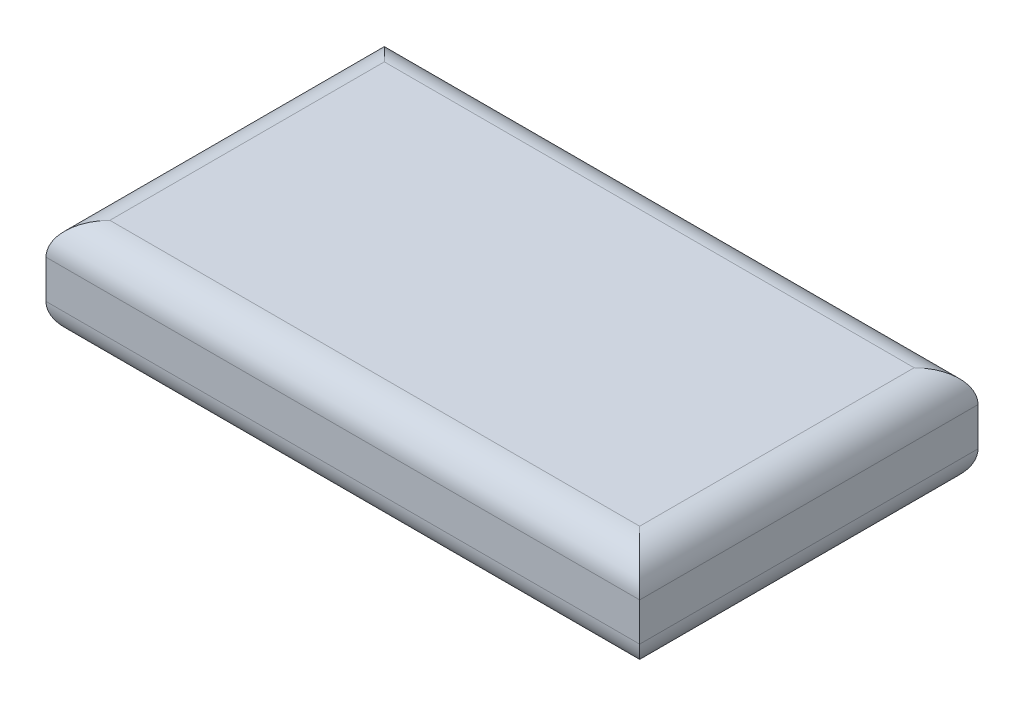
ISO-10303-21;
HEADER;
FILE_DESCRIPTION(('STEP AP214'),'2;1');
FILE_NAME('part.step','',(''),(''),'','','');
FILE_SCHEMA(('AUTOMOTIVE_DESIGN { 1 0 10303 214 1 1 1 1 }'));
ENDSEC;
DATA;
#1=APPLICATION_CONTEXT('core data for automotive mechanical design processes');
#2=APPLICATION_PROTOCOL_DEFINITION('international standard','automotive_design',2000,#1);
#3=PRODUCT_CONTEXT('',#1,'mechanical');
#4=PRODUCT('Part','Part','',(#3));
#5=PRODUCT_RELATED_PRODUCT_CATEGORY('part','',(#4));
#6=PRODUCT_DEFINITION_FORMATION('','',#4);
#7=PRODUCT_DEFINITION_CONTEXT('part definition',#1,'design');
#8=PRODUCT_DEFINITION('design','',#6,#7);
#9=PRODUCT_DEFINITION_SHAPE('','',#8);
#10=(LENGTH_UNIT() NAMED_UNIT(*) SI_UNIT(.MILLI.,.METRE.));
#11=(NAMED_UNIT(*) PLANE_ANGLE_UNIT() SI_UNIT($,.RADIAN.));
#12=(NAMED_UNIT(*) SI_UNIT($,.STERADIAN.) SOLID_ANGLE_UNIT());
#13=UNCERTAINTY_MEASURE_WITH_UNIT(LENGTH_MEASURE(1.E-05),#10,'distance_accuracy_value','');
#14=(GEOMETRIC_REPRESENTATION_CONTEXT(3) GLOBAL_UNCERTAINTY_ASSIGNED_CONTEXT((#13)) GLOBAL_UNIT_ASSIGNED_CONTEXT((#10,
#11,#12)) REPRESENTATION_CONTEXT('',''));
#15=CARTESIAN_POINT('',(0.,0.,0.));
#16=DIRECTION('',(0.,0.,1.));
#17=DIRECTION('',(1.,0.,0.));
#18=AXIS2_PLACEMENT_3D('',#15,#16,#17);
#19=CARTESIAN_POINT('',(23.25,8.,13.25));
#20=DIRECTION('',(-1.,0.,0.));
#21=DIRECTION('',(0.,0.,1.));
#22=AXIS2_PLACEMENT_3D('',#19,#20,#21);
#23=PLANE('',#22);
#24=DIRECTION('',(0.,-1.,0.));
#25=VECTOR('',#24,1.);
#26=CARTESIAN_POINT('',(23.25,8.,13.25));
#27=LINE('',#26,#25);
#28=CARTESIAN_POINT('',(23.25,5.5,13.25));
#29=VERTEX_POINT('',#28);
#30=CARTESIAN_POINT('',(23.25,2.5,13.25));
#31=VERTEX_POINT('',#30);
#32=EDGE_CURVE('E106',#29,#31,#27,.T.);
#33=ORIENTED_EDGE('',*,*,#32,.T.);
#34=DIRECTION('',(0.,0.,-1.));
#35=VECTOR('',#34,1.);
#36=CARTESIAN_POINT('',(23.25,2.5,-13.25));
#37=LINE('',#36,#35);
#38=CARTESIAN_POINT('',(23.25,2.5,-13.25));
#39=VERTEX_POINT('',#38);
#40=EDGE_CURVE('E159',#31,#39,#37,.T.);
#41=ORIENTED_EDGE('',*,*,#40,.T.);
#42=DIRECTION('',(0.,-1.,0.));
#43=VECTOR('',#42,1.);
#44=CARTESIAN_POINT('',(23.25,8.,-13.25));
#45=LINE('',#44,#43);
#46=CARTESIAN_POINT('',(23.25,5.5,-13.25));
#47=VERTEX_POINT('',#46);
#48=EDGE_CURVE('E132',#47,#39,#45,.T.);
#49=ORIENTED_EDGE('',*,*,#48,.F.);
#50=DIRECTION('',(0.,0.,-1.));
#51=VECTOR('',#50,1.);
#52=CARTESIAN_POINT('',(23.25,5.5,13.25));
#53=LINE('',#52,#51);
#54=EDGE_CURVE('E161',#47,#29,#53,.F.);
#55=ORIENTED_EDGE('',*,*,#54,.T.);
#56=EDGE_LOOP('',(#33,#41,#49,#55));
#57=FACE_BOUND('',#56,.T.);
#58=ADVANCED_FACE('F33',(#57),#23,.F.);
#59=CARTESIAN_POINT('',(-23.25,8.,-13.25));
#60=DIRECTION('',(0.,0.,1.));
#61=DIRECTION('',(1.,0.,0.));
#62=AXIS2_PLACEMENT_3D('',#59,#60,#61);
#63=PLANE('',#62);
#64=ORIENTED_EDGE('',*,*,#48,.T.);
#65=DIRECTION('',(-1.,0.,0.));
#66=VECTOR('',#65,1.);
#67=CARTESIAN_POINT('',(-23.25,2.5,-13.25));
#68=LINE('',#67,#66);
#69=CARTESIAN_POINT('',(-23.25,2.5,-13.25));
#70=VERTEX_POINT('',#69);
#71=EDGE_CURVE('E155',#39,#70,#68,.T.);
#72=ORIENTED_EDGE('',*,*,#71,.T.);
#73=DIRECTION('',(0.,-1.,0.));
#74=VECTOR('',#73,1.);
#75=CARTESIAN_POINT('',(-23.25,8.,-13.25));
#76=LINE('',#75,#74);
#77=CARTESIAN_POINT('',(-23.25,5.5,-13.25));
#78=VERTEX_POINT('',#77);
#79=EDGE_CURVE('E123',#78,#70,#76,.T.);
#80=ORIENTED_EDGE('',*,*,#79,.F.);
#81=DIRECTION('',(-1.,0.,0.));
#82=VECTOR('',#81,1.);
#83=CARTESIAN_POINT('',(-23.25,5.5,-13.25));
#84=LINE('',#83,#82);
#85=EDGE_CURVE('E157',#78,#47,#84,.F.);
#86=ORIENTED_EDGE('',*,*,#85,.T.);
#87=EDGE_LOOP('',(#64,#72,#80,#86));
#88=FACE_BOUND('',#87,.T.);
#89=ADVANCED_FACE('F200',(#88),#63,.F.);
#90=CARTESIAN_POINT('',(-23.25,8.,13.25));
#91=DIRECTION('',(1.,0.,0.));
#92=DIRECTION('',(0.,0.,-1.));
#93=AXIS2_PLACEMENT_3D('',#90,#91,#92);
#94=PLANE('',#93);
#95=ORIENTED_EDGE('',*,*,#79,.T.);
#96=DIRECTION('',(0.,0.,1.));
#97=VECTOR('',#96,1.);
#98=CARTESIAN_POINT('',(-23.25,2.5,13.25));
#99=LINE('',#98,#97);
#100=CARTESIAN_POINT('',(-23.25,2.5,13.25));
#101=VERTEX_POINT('',#100);
#102=EDGE_CURVE('E122',#70,#101,#99,.T.);
#103=ORIENTED_EDGE('',*,*,#102,.T.);
#104=DIRECTION('',(0.,-1.,0.));
#105=VECTOR('',#104,1.);
#106=CARTESIAN_POINT('',(-23.25,8.,13.25));
#107=LINE('',#106,#105);
#108=CARTESIAN_POINT('',(-23.25,5.5,13.25));
#109=VERTEX_POINT('',#108);
#110=EDGE_CURVE('E104',#109,#101,#107,.T.);
#111=ORIENTED_EDGE('',*,*,#110,.F.);
#112=DIRECTION('',(0.,0.,1.));
#113=VECTOR('',#112,1.);
#114=CARTESIAN_POINT('',(-23.25,5.5,13.25));
#115=LINE('',#114,#113);
#116=EDGE_CURVE('E119',#109,#78,#115,.F.);
#117=ORIENTED_EDGE('',*,*,#116,.T.);
#118=EDGE_LOOP('',(#95,#103,#111,#117));
#119=FACE_BOUND('',#118,.T.);
#120=ADVANCED_FACE('F118',(#119),#94,.F.);
#121=CARTESIAN_POINT('',(-23.25,8.,13.25));
#122=DIRECTION('',(0.,0.,-1.));
#123=DIRECTION('',(-1.,0.,0.));
#124=AXIS2_PLACEMENT_3D('',#121,#122,#123);
#125=PLANE('',#124);
#126=ORIENTED_EDGE('',*,*,#110,.T.);
#127=DIRECTION('',(1.,0.,0.));
#128=VECTOR('',#127,1.);
#129=CARTESIAN_POINT('',(23.25,2.5,13.25));
#130=LINE('',#129,#128);
#131=EDGE_CURVE('E111',#101,#31,#130,.T.);
#132=ORIENTED_EDGE('',*,*,#131,.T.);
#133=ORIENTED_EDGE('',*,*,#32,.F.);
#134=DIRECTION('',(1.,0.,0.));
#135=VECTOR('',#134,1.);
#136=CARTESIAN_POINT('',(-23.25,5.5,13.25));
#137=LINE('',#136,#135);
#138=EDGE_CURVE('E101',#29,#109,#137,.F.);
#139=ORIENTED_EDGE('',*,*,#138,.T.);
#140=EDGE_LOOP('',(#126,#132,#133,#139));
#141=FACE_BOUND('',#140,.T.);
#142=ADVANCED_FACE('F103',(#141),#125,.F.);
#143=CARTESIAN_POINT('',(0.,8.,0.));
#144=DIRECTION('',(0.,-1.,0.));
#145=DIRECTION('',(0.,0.,-1.));
#146=AXIS2_PLACEMENT_3D('',#143,#144,#145);
#147=PLANE('',#146);
#148=DIRECTION('',(1.,0.,0.));
#149=VECTOR('',#148,1.);
#150=CARTESIAN_POINT('',(0.,8.,10.75));
#151=LINE('',#150,#149);
#152=CARTESIAN_POINT('',(-20.75,8.,10.75));
#153=VERTEX_POINT('',#152);
#154=CARTESIAN_POINT('',(20.75,8.,10.75));
#155=VERTEX_POINT('',#154);
#156=EDGE_CURVE('E135',#153,#155,#151,.T.);
#157=ORIENTED_EDGE('',*,*,#156,.T.);
#158=DIRECTION('',(0.,0.,-1.));
#159=VECTOR('',#158,1.);
#160=CARTESIAN_POINT('',(20.75,8.,0.));
#161=LINE('',#160,#159);
#162=CARTESIAN_POINT('',(20.75,8.,-10.75));
#163=VERTEX_POINT('',#162);
#164=EDGE_CURVE('E11',#155,#163,#161,.T.);
#165=ORIENTED_EDGE('',*,*,#164,.T.);
#166=DIRECTION('',(-1.,0.,0.));
#167=VECTOR('',#166,1.);
#168=CARTESIAN_POINT('',(0.,8.,-10.75));
#169=LINE('',#168,#167);
#170=CARTESIAN_POINT('',(-20.75,8.,-10.75));
#171=VERTEX_POINT('',#170);
#172=EDGE_CURVE('E42',#163,#171,#169,.T.);
#173=ORIENTED_EDGE('',*,*,#172,.T.);
#174=DIRECTION('',(0.,0.,1.));
#175=VECTOR('',#174,1.);
#176=CARTESIAN_POINT('',(-20.75,8.,0.));
#177=LINE('',#176,#175);
#178=EDGE_CURVE('E152',#171,#153,#177,.T.);
#179=ORIENTED_EDGE('',*,*,#178,.T.);
#180=EDGE_LOOP('',(#157,#165,#173,#179));
#181=FACE_BOUND('',#180,.T.);
#182=ADVANCED_FACE('F203',(#181),#147,.F.);
#183=CARTESIAN_POINT('',(0.,0.,0.));
#184=DIRECTION('',(0.,-1.,0.));
#185=DIRECTION('',(0.,0.,-1.));
#186=AXIS2_PLACEMENT_3D('',#183,#184,#185);
#187=PLANE('',#186);
#188=DIRECTION('',(1.,0.,0.));
#189=VECTOR('',#188,1.);
#190=CARTESIAN_POINT('',(-23.25,0.,10.75));
#191=LINE('',#190,#189);
#192=CARTESIAN_POINT('',(20.75,0.,10.75));
#193=VERTEX_POINT('',#192);
#194=CARTESIAN_POINT('',(-20.75,0.,10.75));
#195=VERTEX_POINT('',#194);
#196=EDGE_CURVE('E166',#193,#195,#191,.F.);
#197=ORIENTED_EDGE('',*,*,#196,.T.);
#198=DIRECTION('',(0.,0.,1.));
#199=VECTOR('',#198,1.);
#200=CARTESIAN_POINT('',(-20.75,0.,-13.25));
#201=LINE('',#200,#199);
#202=CARTESIAN_POINT('',(-20.75,0.,-10.75));
#203=VERTEX_POINT('',#202);
#204=EDGE_CURVE('E112',#195,#203,#201,.F.);
#205=ORIENTED_EDGE('',*,*,#204,.T.);
#206=DIRECTION('',(-1.,0.,0.));
#207=VECTOR('',#206,1.);
#208=CARTESIAN_POINT('',(23.25,0.,-10.75));
#209=LINE('',#208,#207);
#210=CARTESIAN_POINT('',(20.75,0.,-10.75));
#211=VERTEX_POINT('',#210);
#212=EDGE_CURVE('E170',#203,#211,#209,.F.);
#213=ORIENTED_EDGE('',*,*,#212,.T.);
#214=DIRECTION('',(0.,0.,-1.));
#215=VECTOR('',#214,1.);
#216=CARTESIAN_POINT('',(20.75,0.,13.25));
#217=LINE('',#216,#215);
#218=EDGE_CURVE('E168',#211,#193,#217,.F.);
#219=ORIENTED_EDGE('',*,*,#218,.T.);
#220=EDGE_LOOP('',(#197,#205,#213,#219));
#221=FACE_BOUND('',#220,.T.);
#222=ADVANCED_FACE('F192',(#221),#187,.T.);
#223=CARTESIAN_POINT('',(20.75,2.5,13.25));
#224=DIRECTION('',(0.,0.,1.));
#225=DIRECTION('',(1.,0.,0.));
#226=AXIS2_PLACEMENT_3D('',#223,#224,#225);
#227=CYLINDRICAL_SURFACE('',#226,2.5);
#228=CARTESIAN_POINT('',(20.75,2.5,10.75));
#229=DIRECTION('',(-0.707106781186547,0.,0.707106781186547));
#230=DIRECTION('',(0.707106781186547,0.,0.707106781186547));
#231=AXIS2_PLACEMENT_3D('',#228,#229,#230);
#232=ELLIPSE('',#231,3.53553390593274,2.5);
#233=EDGE_CURVE('E147',#193,#31,#232,.T.);
#234=ORIENTED_EDGE('',*,*,#233,.F.);
#235=ORIENTED_EDGE('',*,*,#218,.F.);
#236=CARTESIAN_POINT('',(20.75,2.5,-10.75));
#237=DIRECTION('',(0.707106781186547,0.,0.707106781186547));
#238=DIRECTION('',(0.707106781186547,0.,-0.707106781186547));
#239=AXIS2_PLACEMENT_3D('',#236,#237,#238);
#240=ELLIPSE('',#239,3.53553390593274,2.5);
#241=EDGE_CURVE('E144',#39,#211,#240,.F.);
#242=ORIENTED_EDGE('',*,*,#241,.F.);
#243=ORIENTED_EDGE('',*,*,#40,.F.);
#244=EDGE_LOOP('',(#234,#235,#242,#243));
#245=FACE_BOUND('',#244,.T.);
#246=ADVANCED_FACE('F182',(#245),#227,.T.);
#247=CARTESIAN_POINT('',(-23.25,2.5,-10.75));
#248=DIRECTION('',(1.,0.,0.));
#249=DIRECTION('',(0.,0.,-1.));
#250=AXIS2_PLACEMENT_3D('',#247,#248,#249);
#251=CYLINDRICAL_SURFACE('',#250,2.5);
#252=ORIENTED_EDGE('',*,*,#241,.T.);
#253=ORIENTED_EDGE('',*,*,#212,.F.);
#254=CARTESIAN_POINT('',(-20.75,2.5,-10.75));
#255=DIRECTION('',(0.707106781186547,0.,-0.707106781186547));
#256=DIRECTION('',(0.707106781186547,0.,0.707106781186547));
#257=AXIS2_PLACEMENT_3D('',#254,#255,#256);
#258=ELLIPSE('',#257,3.53553390593274,2.5);
#259=EDGE_CURVE('E137',#70,#203,#258,.F.);
#260=ORIENTED_EDGE('',*,*,#259,.F.);
#261=ORIENTED_EDGE('',*,*,#71,.F.);
#262=EDGE_LOOP('',(#252,#253,#260,#261));
#263=FACE_BOUND('',#262,.T.);
#264=ADVANCED_FACE('F198',(#263),#251,.T.);
#265=CARTESIAN_POINT('',(-23.25,2.5,10.75));
#266=DIRECTION('',(-1.,0.,0.));
#267=DIRECTION('',(0.,0.,1.));
#268=AXIS2_PLACEMENT_3D('',#265,#266,#267);
#269=CYLINDRICAL_SURFACE('',#268,2.5);
#270=ORIENTED_EDGE('',*,*,#233,.T.);
#271=ORIENTED_EDGE('',*,*,#131,.F.);
#272=CARTESIAN_POINT('',(-20.75,2.5,10.75));
#273=DIRECTION('',(-0.707106781186547,0.,-0.707106781186547));
#274=DIRECTION('',(-0.707106781186547,0.,0.707106781186547));
#275=AXIS2_PLACEMENT_3D('',#272,#273,#274);
#276=ELLIPSE('',#275,3.53553390593274,2.5);
#277=EDGE_CURVE('E136',#195,#101,#276,.T.);
#278=ORIENTED_EDGE('',*,*,#277,.F.);
#279=ORIENTED_EDGE('',*,*,#196,.F.);
#280=EDGE_LOOP('',(#270,#271,#278,#279));
#281=FACE_BOUND('',#280,.T.);
#282=ADVANCED_FACE('F188',(#281),#269,.T.);
#283=CARTESIAN_POINT('',(-20.75,2.5,13.25));
#284=DIRECTION('',(0.,0.,-1.));
#285=DIRECTION('',(-1.,0.,0.));
#286=AXIS2_PLACEMENT_3D('',#283,#284,#285);
#287=CYLINDRICAL_SURFACE('',#286,2.5);
#288=ORIENTED_EDGE('',*,*,#259,.T.);
#289=ORIENTED_EDGE('',*,*,#204,.F.);
#290=ORIENTED_EDGE('',*,*,#277,.T.);
#291=ORIENTED_EDGE('',*,*,#102,.F.);
#292=EDGE_LOOP('',(#288,#289,#290,#291));
#293=FACE_BOUND('',#292,.T.);
#294=ADVANCED_FACE('F194',(#293),#287,.T.);
#295=CARTESIAN_POINT('',(-20.75,5.5,0.));
#296=DIRECTION('',(0.,0.,1.));
#297=DIRECTION('',(1.,0.,0.));
#298=AXIS2_PLACEMENT_3D('',#295,#296,#297);
#299=CYLINDRICAL_SURFACE('',#298,2.5);
#300=CARTESIAN_POINT('',(-20.75,5.5,-10.75));
#301=DIRECTION('',(-0.707106781186547,0.,0.707106781186547));
#302=DIRECTION('',(0.707106781186547,0.,0.707106781186547));
#303=AXIS2_PLACEMENT_3D('',#300,#301,#302);
#304=ELLIPSE('',#303,3.53553390593274,2.5);
#305=EDGE_CURVE('E130',#78,#171,#304,.F.);
#306=ORIENTED_EDGE('',*,*,#305,.F.);
#307=ORIENTED_EDGE('',*,*,#116,.F.);
#308=CARTESIAN_POINT('',(-20.75,5.5,10.75));
#309=DIRECTION('',(0.707106781186547,0.,0.707106781186547));
#310=DIRECTION('',(0.707106781186547,0.,-0.707106781186547));
#311=AXIS2_PLACEMENT_3D('',#308,#309,#310);
#312=ELLIPSE('',#311,3.53553390593274,2.5);
#313=EDGE_CURVE('E37',#153,#109,#312,.T.);
#314=ORIENTED_EDGE('',*,*,#313,.F.);
#315=ORIENTED_EDGE('',*,*,#178,.F.);
#316=EDGE_LOOP('',(#306,#307,#314,#315));
#317=FACE_BOUND('',#316,.T.);
#318=ADVANCED_FACE('F35',(#317),#299,.T.);
#319=CARTESIAN_POINT('',(0.,5.5,10.75));
#320=DIRECTION('',(1.,0.,0.));
#321=DIRECTION('',(0.,0.,-1.));
#322=AXIS2_PLACEMENT_3D('',#319,#320,#321);
#323=CYLINDRICAL_SURFACE('',#322,2.5);
#324=ORIENTED_EDGE('',*,*,#313,.T.);
#325=ORIENTED_EDGE('',*,*,#138,.F.);
#326=CARTESIAN_POINT('',(20.75,5.5,10.75));
#327=DIRECTION('',(0.707106781186547,0.,-0.707106781186547));
#328=DIRECTION('',(0.707106781186547,0.,0.707106781186547));
#329=AXIS2_PLACEMENT_3D('',#326,#327,#328);
#330=ELLIPSE('',#329,3.53553390593274,2.5);
#331=EDGE_CURVE('E139',#155,#29,#330,.T.);
#332=ORIENTED_EDGE('',*,*,#331,.F.);
#333=ORIENTED_EDGE('',*,*,#156,.F.);
#334=EDGE_LOOP('',(#324,#325,#332,#333));
#335=FACE_BOUND('',#334,.T.);
#336=ADVANCED_FACE('F134',(#335),#323,.T.);
#337=CARTESIAN_POINT('',(0.,5.5,-10.75));
#338=DIRECTION('',(-1.,0.,0.));
#339=DIRECTION('',(0.,0.,1.));
#340=AXIS2_PLACEMENT_3D('',#337,#338,#339);
#341=CYLINDRICAL_SURFACE('',#340,2.5);
#342=ORIENTED_EDGE('',*,*,#305,.T.);
#343=ORIENTED_EDGE('',*,*,#172,.F.);
#344=CARTESIAN_POINT('',(20.75,5.5,-10.75));
#345=DIRECTION('',(-0.707106781186547,0.,-0.707106781186547));
#346=DIRECTION('',(-0.707106781186547,0.,0.707106781186547));
#347=AXIS2_PLACEMENT_3D('',#344,#345,#346);
#348=ELLIPSE('',#347,3.53553390593274,2.5);
#349=EDGE_CURVE('E50',#47,#163,#348,.F.);
#350=ORIENTED_EDGE('',*,*,#349,.F.);
#351=ORIENTED_EDGE('',*,*,#85,.F.);
#352=EDGE_LOOP('',(#342,#343,#350,#351));
#353=FACE_BOUND('',#352,.T.);
#354=ADVANCED_FACE('F202',(#353),#341,.T.);
#355=CARTESIAN_POINT('',(20.75,5.5,0.));
#356=DIRECTION('',(0.,0.,-1.));
#357=DIRECTION('',(-1.,0.,0.));
#358=AXIS2_PLACEMENT_3D('',#355,#356,#357);
#359=CYLINDRICAL_SURFACE('',#358,2.5);
#360=ORIENTED_EDGE('',*,*,#331,.T.);
#361=ORIENTED_EDGE('',*,*,#54,.F.);
#362=ORIENTED_EDGE('',*,*,#349,.T.);
#363=ORIENTED_EDGE('',*,*,#164,.F.);
#364=EDGE_LOOP('',(#360,#361,#362,#363));
#365=FACE_BOUND('',#364,.T.);
#366=ADVANCED_FACE('F201',(#365),#359,.T.);
#367=CLOSED_SHELL('',(#58,#89,#120,#142,#182,#222,#246,#264,#282,#294,#318,#336,#354,#366));
#368=MANIFOLD_SOLID_BREP('B2',#367);
#369=ADVANCED_BREP_SHAPE_REPRESENTATION('',(#18,#368),#14);
#370=SHAPE_DEFINITION_REPRESENTATION(#9,#369);
ENDSEC;
END-ISO-10303-21;
